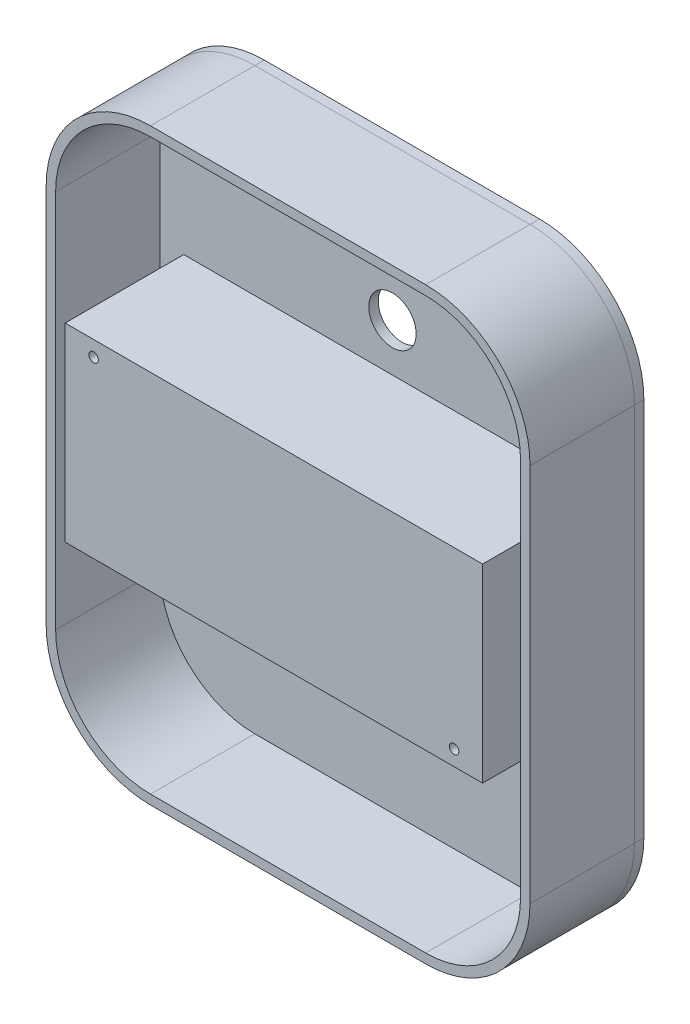
ISO-10303-21;
HEADER;
FILE_DESCRIPTION(('STEP AP214'),'2;1');
FILE_NAME('part.step','',(''),(''),'','','');
FILE_SCHEMA(('AUTOMOTIVE_DESIGN { 1 0 10303 214 1 1 1 1 }'));
ENDSEC;
DATA;
#1=APPLICATION_CONTEXT('core data for automotive mechanical design processes');
#2=APPLICATION_PROTOCOL_DEFINITION('international standard','automotive_design',2000,#1);
#3=PRODUCT_CONTEXT('',#1,'mechanical');
#4=PRODUCT('Part','Part','',(#3));
#5=PRODUCT_RELATED_PRODUCT_CATEGORY('part','',(#4));
#6=PRODUCT_DEFINITION_FORMATION('','',#4);
#7=PRODUCT_DEFINITION_CONTEXT('part definition',#1,'design');
#8=PRODUCT_DEFINITION('design','',#6,#7);
#9=PRODUCT_DEFINITION_SHAPE('','',#8);
#10=(LENGTH_UNIT() NAMED_UNIT(*) SI_UNIT(.MILLI.,.METRE.));
#11=(NAMED_UNIT(*) PLANE_ANGLE_UNIT() SI_UNIT($,.RADIAN.));
#12=(NAMED_UNIT(*) SI_UNIT($,.STERADIAN.) SOLID_ANGLE_UNIT());
#13=UNCERTAINTY_MEASURE_WITH_UNIT(LENGTH_MEASURE(1.E-05),#10,'distance_accuracy_value','');
#14=(GEOMETRIC_REPRESENTATION_CONTEXT(3) GLOBAL_UNCERTAINTY_ASSIGNED_CONTEXT((#13)) GLOBAL_UNIT_ASSIGNED_CONTEXT((#10,
#11,#12)) REPRESENTATION_CONTEXT('',''));
#15=CARTESIAN_POINT('',(0.,0.,0.));
#16=DIRECTION('',(0.,0.,1.));
#17=DIRECTION('',(1.,0.,0.));
#18=AXIS2_PLACEMENT_3D('',#15,#16,#17);
#19=CARTESIAN_POINT('',(0.,0.,25.));
#20=DIRECTION('',(0.,0.,1.));
#21=DIRECTION('',(1.,0.,0.));
#22=AXIS2_PLACEMENT_3D('',#19,#20,#21);
#23=PLANE('',#22);
#24=CARTESIAN_POINT('',(-38.,16.75,25.));
#25=DIRECTION('',(0.,0.,1.));
#26=DIRECTION('',(1.,0.,0.));
#27=AXIS2_PLACEMENT_3D('',#24,#25,#26);
#28=CIRCLE('',#27,0.999999999999998);
#29=CARTESIAN_POINT('',(-37.,16.75,25.));
#30=VERTEX_POINT('',#29);
#31=EDGE_CURVE('E220',#30,#30,#28,.T.);
#32=ORIENTED_EDGE('',*,*,#31,.F.);
#33=EDGE_LOOP('',(#32));
#34=FACE_BOUND('',#33,.T.);
#35=DIRECTION('',(1.,0.,0.));
#36=VECTOR('',#35,1.);
#37=CARTESIAN_POINT('',(-43.9999999999999,-20.,25.));
#38=LINE('',#37,#36);
#39=CARTESIAN_POINT('',(-43.9999999999999,-20.,25.));
#40=VERTEX_POINT('',#39);
#41=CARTESIAN_POINT('',(44.0000000000001,-19.9999999999997,25.));
#42=VERTEX_POINT('',#41);
#43=EDGE_CURVE('E226',#40,#42,#38,.T.);
#44=ORIENTED_EDGE('',*,*,#43,.T.);
#45=DIRECTION('',(0.,1.,0.));
#46=VECTOR('',#45,1.);
#47=CARTESIAN_POINT('',(44.0000000000001,-19.9999999999997,25.));
#48=LINE('',#47,#46);
#49=CARTESIAN_POINT('',(44.0000000000001,20.,25.));
#50=VERTEX_POINT('',#49);
#51=EDGE_CURVE('E228',#42,#50,#48,.T.);
#52=ORIENTED_EDGE('',*,*,#51,.T.);
#53=DIRECTION('',(-1.,0.,0.));
#54=VECTOR('',#53,1.);
#55=CARTESIAN_POINT('',(-44.,20.,25.));
#56=LINE('',#55,#54);
#57=CARTESIAN_POINT('',(-44.,20.,25.));
#58=VERTEX_POINT('',#57);
#59=EDGE_CURVE('E231',#50,#58,#56,.T.);
#60=ORIENTED_EDGE('',*,*,#59,.T.);
#61=DIRECTION('',(0.,-1.,0.));
#62=VECTOR('',#61,1.);
#63=CARTESIAN_POINT('',(-43.9999999999999,-20.,25.));
#64=LINE('',#63,#62);
#65=EDGE_CURVE('E65',#58,#40,#64,.T.);
#66=ORIENTED_EDGE('',*,*,#65,.T.);
#67=EDGE_LOOP('',(#44,#52,#60,#66));
#68=FACE_BOUND('',#67,.T.);
#69=CARTESIAN_POINT('',(38.,-16.75,25.));
#70=DIRECTION('',(0.,0.,1.));
#71=DIRECTION('',(1.,0.,0.));
#72=AXIS2_PLACEMENT_3D('',#69,#70,#71);
#73=CIRCLE('',#72,0.999999999999998);
#74=CARTESIAN_POINT('',(39.,-16.75,25.));
#75=VERTEX_POINT('',#74);
#76=EDGE_CURVE('E214',#75,#75,#73,.T.);
#77=ORIENTED_EDGE('',*,*,#76,.F.);
#78=EDGE_LOOP('',(#77));
#79=FACE_BOUND('',#78,.T.);
#80=ADVANCED_FACE('F49',(#34,#68,#79),#23,.T.);
#81=CARTESIAN_POINT('',(-43.9999999999999,-20.,25.));
#82=DIRECTION('',(0.,1.,0.));
#83=DIRECTION('',(-1.,0.,0.));
#84=AXIS2_PLACEMENT_3D('',#81,#82,#83);
#85=PLANE('',#84);
#86=DIRECTION('',(1.,0.,0.));
#87=VECTOR('',#86,1.);
#88=CARTESIAN_POINT('',(-43.9999999999999,-20.,0.));
#89=LINE('',#88,#87);
#90=CARTESIAN_POINT('',(-43.9999999999999,-20.,0.));
#91=VERTEX_POINT('',#90);
#92=CARTESIAN_POINT('',(44.0000000000001,-19.9999999999997,0.));
#93=VERTEX_POINT('',#92);
#94=EDGE_CURVE('E223',#91,#93,#89,.T.);
#95=ORIENTED_EDGE('',*,*,#94,.T.);
#96=DIRECTION('',(0.,0.,-1.));
#97=VECTOR('',#96,1.);
#98=CARTESIAN_POINT('',(44.0000000000001,-19.9999999999997,25.));
#99=LINE('',#98,#97);
#100=EDGE_CURVE('E12',#42,#93,#99,.T.);
#101=ORIENTED_EDGE('',*,*,#100,.F.);
#102=ORIENTED_EDGE('',*,*,#43,.F.);
#103=DIRECTION('',(0.,0.,-1.));
#104=VECTOR('',#103,1.);
#105=CARTESIAN_POINT('',(-43.9999999999999,-20.,25.));
#106=LINE('',#105,#104);
#107=EDGE_CURVE('E234',#40,#91,#106,.T.);
#108=ORIENTED_EDGE('',*,*,#107,.T.);
#109=EDGE_LOOP('',(#95,#101,#102,#108));
#110=FACE_BOUND('',#109,.T.);
#111=ADVANCED_FACE('F51',(#110),#85,.F.);
#112=CARTESIAN_POINT('',(44.0000000000001,-19.9999999999997,25.));
#113=DIRECTION('',(-1.,0.,0.));
#114=DIRECTION('',(0.,-1.,0.));
#115=AXIS2_PLACEMENT_3D('',#112,#113,#114);
#116=PLANE('',#115);
#117=DIRECTION('',(0.,1.,0.));
#118=VECTOR('',#117,1.);
#119=CARTESIAN_POINT('',(44.0000000000001,-19.9999999999997,0.));
#120=LINE('',#119,#118);
#121=CARTESIAN_POINT('',(44.0000000000001,20.,0.));
#122=VERTEX_POINT('',#121);
#123=EDGE_CURVE('E237',#93,#122,#120,.T.);
#124=ORIENTED_EDGE('',*,*,#123,.T.);
#125=DIRECTION('',(0.,0.,-1.));
#126=VECTOR('',#125,1.);
#127=CARTESIAN_POINT('',(44.0000000000001,20.,25.));
#128=LINE('',#127,#126);
#129=EDGE_CURVE('E58',#50,#122,#128,.T.);
#130=ORIENTED_EDGE('',*,*,#129,.F.);
#131=ORIENTED_EDGE('',*,*,#51,.F.);
#132=ORIENTED_EDGE('',*,*,#100,.T.);
#133=EDGE_LOOP('',(#124,#130,#131,#132));
#134=FACE_BOUND('',#133,.T.);
#135=ADVANCED_FACE('F257',(#134),#116,.F.);
#136=CARTESIAN_POINT('',(-44.,20.,25.));
#137=DIRECTION('',(0.,-1.,0.));
#138=DIRECTION('',(1.,0.,0.));
#139=AXIS2_PLACEMENT_3D('',#136,#137,#138);
#140=PLANE('',#139);
#141=DIRECTION('',(-1.,0.,0.));
#142=VECTOR('',#141,1.);
#143=CARTESIAN_POINT('',(-44.,20.,0.));
#144=LINE('',#143,#142);
#145=CARTESIAN_POINT('',(-44.,20.,0.));
#146=VERTEX_POINT('',#145);
#147=EDGE_CURVE('E240',#122,#146,#144,.T.);
#148=ORIENTED_EDGE('',*,*,#147,.T.);
#149=DIRECTION('',(0.,0.,-1.));
#150=VECTOR('',#149,1.);
#151=CARTESIAN_POINT('',(-44.,20.,25.));
#152=LINE('',#151,#150);
#153=EDGE_CURVE('E247',#58,#146,#152,.T.);
#154=ORIENTED_EDGE('',*,*,#153,.F.);
#155=ORIENTED_EDGE('',*,*,#59,.F.);
#156=ORIENTED_EDGE('',*,*,#129,.T.);
#157=EDGE_LOOP('',(#148,#154,#155,#156));
#158=FACE_BOUND('',#157,.T.);
#159=ADVANCED_FACE('F253',(#158),#140,.F.);
#160=CARTESIAN_POINT('',(-43.9999999999999,-20.,25.));
#161=DIRECTION('',(1.,0.,0.));
#162=DIRECTION('',(0.,1.,0.));
#163=AXIS2_PLACEMENT_3D('',#160,#161,#162);
#164=PLANE('',#163);
#165=DIRECTION('',(0.,-1.,0.));
#166=VECTOR('',#165,1.);
#167=CARTESIAN_POINT('',(-43.9999999999999,-20.,0.));
#168=LINE('',#167,#166);
#169=EDGE_CURVE('E229',#146,#91,#168,.T.);
#170=ORIENTED_EDGE('',*,*,#169,.T.);
#171=ORIENTED_EDGE('',*,*,#107,.F.);
#172=ORIENTED_EDGE('',*,*,#65,.F.);
#173=ORIENTED_EDGE('',*,*,#153,.T.);
#174=EDGE_LOOP('',(#170,#171,#172,#173));
#175=FACE_BOUND('',#174,.T.);
#176=ADVANCED_FACE('F263',(#175),#164,.F.);
#177=CARTESIAN_POINT('',(-38.,16.75,25.));
#178=DIRECTION('',(0.,0.,-1.));
#179=DIRECTION('',(-1.,0.,0.));
#180=AXIS2_PLACEMENT_3D('',#177,#178,#179);
#181=CYLINDRICAL_SURFACE('',#180,0.999999999999998);
#182=ORIENTED_EDGE('',*,*,#31,.T.);
#183=EDGE_LOOP('',(#182));
#184=FACE_BOUND('',#183,.T.);
#185=CARTESIAN_POINT('',(-38.,16.75,0.));
#186=DIRECTION('',(0.,0.,1.));
#187=DIRECTION('',(1.,0.,0.));
#188=AXIS2_PLACEMENT_3D('',#185,#186,#187);
#189=CIRCLE('',#188,0.999999999999998);
#190=CARTESIAN_POINT('',(-37.,16.75,0.));
#191=VERTEX_POINT('',#190);
#192=EDGE_CURVE('E217',#191,#191,#189,.T.);
#193=ORIENTED_EDGE('',*,*,#192,.F.);
#194=EDGE_LOOP('',(#193));
#195=FACE_BOUND('',#194,.T.);
#196=ADVANCED_FACE('F276',(#184,#195),#181,.F.);
#197=CARTESIAN_POINT('',(38.,-16.75,25.));
#198=DIRECTION('',(0.,0.,-1.));
#199=DIRECTION('',(-1.,0.,0.));
#200=AXIS2_PLACEMENT_3D('',#197,#198,#199);
#201=CYLINDRICAL_SURFACE('',#200,0.999999999999998);
#202=ORIENTED_EDGE('',*,*,#76,.T.);
#203=EDGE_LOOP('',(#202));
#204=FACE_BOUND('',#203,.T.);
#205=CARTESIAN_POINT('',(38.,-16.75,0.));
#206=DIRECTION('',(0.,0.,1.));
#207=DIRECTION('',(1.,0.,0.));
#208=AXIS2_PLACEMENT_3D('',#205,#206,#207);
#209=CIRCLE('',#208,0.999999999999998);
#210=CARTESIAN_POINT('',(39.,-16.75,0.));
#211=VERTEX_POINT('',#210);
#212=EDGE_CURVE('E202',#211,#211,#209,.T.);
#213=ORIENTED_EDGE('',*,*,#212,.F.);
#214=EDGE_LOOP('',(#213));
#215=FACE_BOUND('',#214,.T.);
#216=ADVANCED_FACE('F272',(#204,#215),#201,.F.);
#217=CARTESIAN_POINT('',(-29.,40.,0.));
#218=DIRECTION('',(0.,0.,-1.));
#219=DIRECTION('',(-1.,0.,0.));
#220=AXIS2_PLACEMENT_3D('',#217,#218,#219);
#221=PLANE('',#220);
#222=ORIENTED_EDGE('',*,*,#212,.T.);
#223=EDGE_LOOP('',(#222));
#224=FACE_BOUND('',#223,.T.);
#225=ADVANCED_FACE('F275',(#224),#221,.F.);
#226=ORIENTED_EDGE('',*,*,#192,.T.);
#227=EDGE_LOOP('',(#226));
#228=FACE_BOUND('',#227,.T.);
#229=ADVANCED_FACE('F281',(#228),#221,.F.);
#230=CARTESIAN_POINT('',(-29.,40.,-2.));
#231=DIRECTION('',(0.,0.,1.));
#232=DIRECTION('',(1.,0.,0.));
#233=AXIS2_PLACEMENT_3D('',#230,#231,#232);
#234=CYLINDRICAL_SURFACE('',#233,22.);
#235=CARTESIAN_POINT('',(-29.,40.,0.));
#236=DIRECTION('',(0.,0.,1.));
#237=DIRECTION('',(-1.,0.,0.));
#238=AXIS2_PLACEMENT_3D('',#235,#236,#237);
#239=CIRCLE('',#238,22.);
#240=CARTESIAN_POINT('',(-29.,62.,0.));
#241=VERTEX_POINT('',#240);
#242=CARTESIAN_POINT('',(-51.,40.,0.));
#243=VERTEX_POINT('',#242);
#244=EDGE_CURVE('E183',#241,#243,#239,.T.);
#245=ORIENTED_EDGE('',*,*,#244,.F.);
#246=DIRECTION('',(0.,0.,1.));
#247=VECTOR('',#246,1.);
#248=CARTESIAN_POINT('',(-29.,62.,-2.));
#249=LINE('',#248,#247);
#250=CARTESIAN_POINT('',(-29.,62.,-2.));
#251=VERTEX_POINT('',#250);
#252=EDGE_CURVE('E159',#251,#241,#249,.T.);
#253=ORIENTED_EDGE('',*,*,#252,.F.);
#254=CARTESIAN_POINT('',(-29.,40.,-2.));
#255=DIRECTION('',(0.,0.,1.));
#256=DIRECTION('',(-1.,0.,0.));
#257=AXIS2_PLACEMENT_3D('',#254,#255,#256);
#258=CIRCLE('',#257,22.);
#259=CARTESIAN_POINT('',(-51.,40.,-2.));
#260=VERTEX_POINT('',#259);
#261=EDGE_CURVE('E152',#251,#260,#258,.T.);
#262=ORIENTED_EDGE('',*,*,#261,.T.);
#263=DIRECTION('',(0.,0.,1.));
#264=VECTOR('',#263,1.);
#265=CARTESIAN_POINT('',(-51.,40.,-2.));
#266=LINE('',#265,#264);
#267=EDGE_CURVE('E134',#260,#243,#266,.T.);
#268=ORIENTED_EDGE('',*,*,#267,.T.);
#269=EDGE_LOOP('',(#245,#253,#262,#268));
#270=FACE_BOUND('',#269,.T.);
#271=ADVANCED_FACE('F158',(#270),#234,.T.);
#272=CARTESIAN_POINT('',(-29.,62.,-2.));
#273=DIRECTION('',(0.,1.,0.));
#274=DIRECTION('',(0.,0.,1.));
#275=AXIS2_PLACEMENT_3D('',#272,#273,#274);
#276=PLANE('',#275);
#277=DIRECTION('',(-1.,0.,0.));
#278=VECTOR('',#277,1.);
#279=CARTESIAN_POINT('',(-29.,62.,0.));
#280=LINE('',#279,#278);
#281=CARTESIAN_POINT('',(29.,62.,0.));
#282=VERTEX_POINT('',#281);
#283=EDGE_CURVE('E160',#282,#241,#280,.T.);
#284=ORIENTED_EDGE('',*,*,#283,.F.);
#285=DIRECTION('',(0.,0.,1.));
#286=VECTOR('',#285,1.);
#287=CARTESIAN_POINT('',(29.,62.,-2.));
#288=LINE('',#287,#286);
#289=CARTESIAN_POINT('',(29.,62.,-2.));
#290=VERTEX_POINT('',#289);
#291=EDGE_CURVE('E203',#290,#282,#288,.T.);
#292=ORIENTED_EDGE('',*,*,#291,.F.);
#293=DIRECTION('',(-1.,0.,0.));
#294=VECTOR('',#293,1.);
#295=CARTESIAN_POINT('',(-29.,62.,-2.));
#296=LINE('',#295,#294);
#297=EDGE_CURVE('E145',#290,#251,#296,.T.);
#298=ORIENTED_EDGE('',*,*,#297,.T.);
#299=ORIENTED_EDGE('',*,*,#252,.T.);
#300=EDGE_LOOP('',(#284,#292,#298,#299));
#301=FACE_BOUND('',#300,.T.);
#302=ADVANCED_FACE('F350',(#301),#276,.T.);
#303=CARTESIAN_POINT('',(29.,40.,-2.));
#304=DIRECTION('',(0.,0.,1.));
#305=DIRECTION('',(1.,0.,0.));
#306=AXIS2_PLACEMENT_3D('',#303,#304,#305);
#307=CYLINDRICAL_SURFACE('',#306,22.);
#308=CARTESIAN_POINT('',(29.,40.,0.));
#309=DIRECTION('',(0.,0.,1.));
#310=DIRECTION('',(1.,0.,0.));
#311=AXIS2_PLACEMENT_3D('',#308,#309,#310);
#312=CIRCLE('',#311,22.);
#313=CARTESIAN_POINT('',(51.,40.,0.));
#314=VERTEX_POINT('',#313);
#315=EDGE_CURVE('E163',#314,#282,#312,.T.);
#316=ORIENTED_EDGE('',*,*,#315,.F.);
#317=DIRECTION('',(0.,0.,1.));
#318=VECTOR('',#317,1.);
#319=CARTESIAN_POINT('',(51.,40.,-2.));
#320=LINE('',#319,#318);
#321=CARTESIAN_POINT('',(51.,40.,-2.));
#322=VERTEX_POINT('',#321);
#323=EDGE_CURVE('E205',#322,#314,#320,.T.);
#324=ORIENTED_EDGE('',*,*,#323,.F.);
#325=CARTESIAN_POINT('',(29.,40.,-2.));
#326=DIRECTION('',(0.,0.,1.));
#327=DIRECTION('',(1.,0.,0.));
#328=AXIS2_PLACEMENT_3D('',#325,#326,#327);
#329=CIRCLE('',#328,22.);
#330=EDGE_CURVE('E179',#322,#290,#329,.T.);
#331=ORIENTED_EDGE('',*,*,#330,.T.);
#332=ORIENTED_EDGE('',*,*,#291,.T.);
#333=EDGE_LOOP('',(#316,#324,#331,#332));
#334=FACE_BOUND('',#333,.T.);
#335=ADVANCED_FACE('F464',(#334),#307,.T.);
#336=CARTESIAN_POINT('',(51.,40.,-2.));
#337=DIRECTION('',(1.,0.,0.));
#338=DIRECTION('',(0.,1.,0.));
#339=AXIS2_PLACEMENT_3D('',#336,#337,#338);
#340=PLANE('',#339);
#341=DIRECTION('',(0.,1.,0.));
#342=VECTOR('',#341,1.);
#343=CARTESIAN_POINT('',(51.,40.,0.));
#344=LINE('',#343,#342);
#345=CARTESIAN_POINT('',(51.,-40.,0.));
#346=VERTEX_POINT('',#345);
#347=EDGE_CURVE('E196',#346,#314,#344,.T.);
#348=ORIENTED_EDGE('',*,*,#347,.F.);
#349=DIRECTION('',(0.,0.,1.));
#350=VECTOR('',#349,1.);
#351=CARTESIAN_POINT('',(51.,-40.,-2.));
#352=LINE('',#351,#350);
#353=CARTESIAN_POINT('',(51.,-40.,-2.));
#354=VERTEX_POINT('',#353);
#355=EDGE_CURVE('E207',#354,#346,#352,.T.);
#356=ORIENTED_EDGE('',*,*,#355,.F.);
#357=DIRECTION('',(0.,1.,0.));
#358=VECTOR('',#357,1.);
#359=CARTESIAN_POINT('',(51.,40.,-2.));
#360=LINE('',#359,#358);
#361=EDGE_CURVE('E176',#354,#322,#360,.T.);
#362=ORIENTED_EDGE('',*,*,#361,.T.);
#363=ORIENTED_EDGE('',*,*,#323,.T.);
#364=EDGE_LOOP('',(#348,#356,#362,#363));
#365=FACE_BOUND('',#364,.T.);
#366=ADVANCED_FACE('F357',(#365),#340,.T.);
#367=CARTESIAN_POINT('',(29.,-40.,-2.));
#368=DIRECTION('',(0.,0.,1.));
#369=DIRECTION('',(1.,0.,0.));
#370=AXIS2_PLACEMENT_3D('',#367,#368,#369);
#371=CYLINDRICAL_SURFACE('',#370,22.);
#372=CARTESIAN_POINT('',(29.,-40.,0.));
#373=DIRECTION('',(0.,0.,1.));
#374=DIRECTION('',(-1.,0.,0.));
#375=AXIS2_PLACEMENT_3D('',#372,#373,#374);
#376=CIRCLE('',#375,22.);
#377=CARTESIAN_POINT('',(29.,-62.,0.));
#378=VERTEX_POINT('',#377);
#379=EDGE_CURVE('E193',#378,#346,#376,.T.);
#380=ORIENTED_EDGE('',*,*,#379,.F.);
#381=DIRECTION('',(0.,0.,1.));
#382=VECTOR('',#381,1.);
#383=CARTESIAN_POINT('',(29.,-62.,-2.));
#384=LINE('',#383,#382);
#385=CARTESIAN_POINT('',(29.,-62.,-2.));
#386=VERTEX_POINT('',#385);
#387=EDGE_CURVE('E209',#386,#378,#384,.T.);
#388=ORIENTED_EDGE('',*,*,#387,.F.);
#389=CARTESIAN_POINT('',(29.,-40.,-2.));
#390=DIRECTION('',(0.,0.,1.));
#391=DIRECTION('',(-1.,0.,0.));
#392=AXIS2_PLACEMENT_3D('',#389,#390,#391);
#393=CIRCLE('',#392,22.);
#394=EDGE_CURVE('E173',#386,#354,#393,.T.);
#395=ORIENTED_EDGE('',*,*,#394,.T.);
#396=ORIENTED_EDGE('',*,*,#355,.T.);
#397=EDGE_LOOP('',(#380,#388,#395,#396));
#398=FACE_BOUND('',#397,.T.);
#399=ADVANCED_FACE('F360',(#398),#371,.T.);
#400=CARTESIAN_POINT('',(-29.,-62.,-2.));
#401=DIRECTION('',(0.,-1.,0.));
#402=DIRECTION('',(1.,0.,0.));
#403=AXIS2_PLACEMENT_3D('',#400,#401,#402);
#404=PLANE('',#403);
#405=DIRECTION('',(1.,0.,0.));
#406=VECTOR('',#405,1.);
#407=CARTESIAN_POINT('',(-29.,-62.,0.));
#408=LINE('',#407,#406);
#409=CARTESIAN_POINT('',(-29.,-62.,0.));
#410=VERTEX_POINT('',#409);
#411=EDGE_CURVE('E190',#410,#378,#408,.T.);
#412=ORIENTED_EDGE('',*,*,#411,.F.);
#413=DIRECTION('',(0.,0.,1.));
#414=VECTOR('',#413,1.);
#415=CARTESIAN_POINT('',(-29.,-62.,-2.));
#416=LINE('',#415,#414);
#417=CARTESIAN_POINT('',(-29.,-62.,-2.));
#418=VERTEX_POINT('',#417);
#419=EDGE_CURVE('E211',#418,#410,#416,.T.);
#420=ORIENTED_EDGE('',*,*,#419,.F.);
#421=DIRECTION('',(1.,0.,0.));
#422=VECTOR('',#421,1.);
#423=CARTESIAN_POINT('',(-29.,-62.,-2.));
#424=LINE('',#423,#422);
#425=EDGE_CURVE('E170',#418,#386,#424,.T.);
#426=ORIENTED_EDGE('',*,*,#425,.T.);
#427=ORIENTED_EDGE('',*,*,#387,.T.);
#428=EDGE_LOOP('',(#412,#420,#426,#427));
#429=FACE_BOUND('',#428,.T.);
#430=ADVANCED_FACE('F363',(#429),#404,.T.);
#431=CARTESIAN_POINT('',(-29.,-40.,-2.));
#432=DIRECTION('',(0.,0.,1.));
#433=DIRECTION('',(1.,0.,0.));
#434=AXIS2_PLACEMENT_3D('',#431,#432,#433);
#435=CYLINDRICAL_SURFACE('',#434,22.);
#436=CARTESIAN_POINT('',(-29.,-40.,0.));
#437=DIRECTION('',(0.,0.,1.));
#438=DIRECTION('',(-1.,0.,0.));
#439=AXIS2_PLACEMENT_3D('',#436,#437,#438);
#440=CIRCLE('',#439,22.);
#441=CARTESIAN_POINT('',(-51.,-40.,0.));
#442=VERTEX_POINT('',#441);
#443=EDGE_CURVE('E187',#442,#410,#440,.T.);
#444=ORIENTED_EDGE('',*,*,#443,.F.);
#445=DIRECTION('',(0.,0.,1.));
#446=VECTOR('',#445,1.);
#447=CARTESIAN_POINT('',(-51.,-40.,-2.));
#448=LINE('',#447,#446);
#449=CARTESIAN_POINT('',(-51.,-40.,-2.));
#450=VERTEX_POINT('',#449);
#451=EDGE_CURVE('E144',#450,#442,#448,.T.);
#452=ORIENTED_EDGE('',*,*,#451,.F.);
#453=CARTESIAN_POINT('',(-29.,-40.,-2.));
#454=DIRECTION('',(0.,0.,1.));
#455=DIRECTION('',(-1.,0.,0.));
#456=AXIS2_PLACEMENT_3D('',#453,#454,#455);
#457=CIRCLE('',#456,22.);
#458=EDGE_CURVE('E156',#450,#418,#457,.T.);
#459=ORIENTED_EDGE('',*,*,#458,.T.);
#460=ORIENTED_EDGE('',*,*,#419,.T.);
#461=EDGE_LOOP('',(#444,#452,#459,#460));
#462=FACE_BOUND('',#461,.T.);
#463=ADVANCED_FACE('F302',(#462),#435,.T.);
#464=CARTESIAN_POINT('',(-51.,40.,-2.));
#465=DIRECTION('',(-1.,0.,0.));
#466=DIRECTION('',(0.,-1.,0.));
#467=AXIS2_PLACEMENT_3D('',#464,#465,#466);
#468=PLANE('',#467);
#469=DIRECTION('',(0.,-1.,0.));
#470=VECTOR('',#469,1.);
#471=CARTESIAN_POINT('',(-51.,40.,0.));
#472=LINE('',#471,#470);
#473=EDGE_CURVE('E139',#243,#442,#472,.T.);
#474=ORIENTED_EDGE('',*,*,#473,.F.);
#475=ORIENTED_EDGE('',*,*,#267,.F.);
#476=DIRECTION('',(0.,-1.,0.));
#477=VECTOR('',#476,1.);
#478=CARTESIAN_POINT('',(-51.,40.,-2.));
#479=LINE('',#478,#477);
#480=EDGE_CURVE('E137',#260,#450,#479,.T.);
#481=ORIENTED_EDGE('',*,*,#480,.T.);
#482=ORIENTED_EDGE('',*,*,#451,.T.);
#483=EDGE_LOOP('',(#474,#475,#481,#482));
#484=FACE_BOUND('',#483,.T.);
#485=ADVANCED_FACE('F136',(#484),#468,.T.);
#486=CARTESIAN_POINT('',(-29.,40.,-2.));
#487=DIRECTION('',(0.,0.,-1.));
#488=DIRECTION('',(-1.,0.,0.));
#489=AXIS2_PLACEMENT_3D('',#486,#487,#488);
#490=PLANE('',#489);
#491=CARTESIAN_POINT('',(0.,-30.,-2.));
#492=DIRECTION('',(0.,0.,1.));
#493=DIRECTION('',(1.,0.,0.));
#494=AXIS2_PLACEMENT_3D('',#491,#492,#493);
#495=CIRCLE('',#494,5.);
#496=CARTESIAN_POINT('',(5.,-30.,-2.));
#497=VERTEX_POINT('',#496);
#498=EDGE_CURVE('E321',#497,#497,#495,.T.);
#499=ORIENTED_EDGE('',*,*,#498,.T.);
#500=EDGE_LOOP('',(#499));
#501=FACE_BOUND('',#500,.T.);
#502=CARTESIAN_POINT('',(0.,30.,-2.));
#503=DIRECTION('',(0.,0.,1.));
#504=DIRECTION('',(1.,0.,0.));
#505=AXIS2_PLACEMENT_3D('',#502,#503,#504);
#506=CIRCLE('',#505,5.);
#507=CARTESIAN_POINT('',(5.,30.,-2.));
#508=VERTEX_POINT('',#507);
#509=EDGE_CURVE('E329',#508,#508,#506,.T.);
#510=ORIENTED_EDGE('',*,*,#509,.T.);
#511=EDGE_LOOP('',(#510));
#512=FACE_BOUND('',#511,.T.);
#513=CARTESIAN_POINT('',(0.,-41.,-2.));
#514=DIRECTION('',(0.,0.,1.));
#515=DIRECTION('',(1.,0.,0.));
#516=AXIS2_PLACEMENT_3D('',#513,#514,#515);
#517=CIRCLE('',#516,1.75);
#518=CARTESIAN_POINT('',(1.75000000000001,-41.,-2.));
#519=VERTEX_POINT('',#518);
#520=EDGE_CURVE('E335',#519,#519,#517,.T.);
#521=ORIENTED_EDGE('',*,*,#520,.T.);
#522=EDGE_LOOP('',(#521));
#523=FACE_BOUND('',#522,.T.);
#524=CARTESIAN_POINT('',(0.,41.,-2.));
#525=DIRECTION('',(0.,0.,1.));
#526=DIRECTION('',(1.,0.,0.));
#527=AXIS2_PLACEMENT_3D('',#524,#525,#526);
#528=CIRCLE('',#527,1.75);
#529=CARTESIAN_POINT('',(1.75000000000001,41.,-2.));
#530=VERTEX_POINT('',#529);
#531=EDGE_CURVE('E185',#530,#530,#528,.T.);
#532=ORIENTED_EDGE('',*,*,#531,.T.);
#533=EDGE_LOOP('',(#532));
#534=FACE_BOUND('',#533,.T.);
#535=ORIENTED_EDGE('',*,*,#261,.F.);
#536=ORIENTED_EDGE('',*,*,#297,.F.);
#537=ORIENTED_EDGE('',*,*,#330,.F.);
#538=ORIENTED_EDGE('',*,*,#361,.F.);
#539=ORIENTED_EDGE('',*,*,#394,.F.);
#540=ORIENTED_EDGE('',*,*,#425,.F.);
#541=ORIENTED_EDGE('',*,*,#458,.F.);
#542=ORIENTED_EDGE('',*,*,#480,.F.);
#543=EDGE_LOOP('',(#535,#536,#537,#538,#539,#540,#541,#542));
#544=FACE_BOUND('',#543,.T.);
#545=ADVANCED_FACE('F150',(#501,#512,#523,#534,#544),#490,.T.);
#546=ORIENTED_EDGE('',*,*,#94,.F.);
#547=ORIENTED_EDGE('',*,*,#169,.F.);
#548=ORIENTED_EDGE('',*,*,#147,.F.);
#549=ORIENTED_EDGE('',*,*,#123,.F.);
#550=EDGE_LOOP('',(#546,#547,#548,#549));
#551=FACE_BOUND('',#550,.T.);
#552=CARTESIAN_POINT('',(0.,-30.,0.));
#553=DIRECTION('',(0.,0.,1.));
#554=DIRECTION('',(1.,0.,0.));
#555=AXIS2_PLACEMENT_3D('',#552,#553,#554);
#556=CIRCLE('',#555,5.);
#557=CARTESIAN_POINT('',(5.,-30.,0.));
#558=VERTEX_POINT('',#557);
#559=EDGE_CURVE('E324',#558,#558,#556,.T.);
#560=ORIENTED_EDGE('',*,*,#559,.F.);
#561=EDGE_LOOP('',(#560));
#562=FACE_BOUND('',#561,.T.);
#563=CARTESIAN_POINT('',(0.,30.,0.));
#564=DIRECTION('',(0.,0.,1.));
#565=DIRECTION('',(1.,0.,0.));
#566=AXIS2_PLACEMENT_3D('',#563,#564,#565);
#567=CIRCLE('',#566,5.);
#568=CARTESIAN_POINT('',(5.,30.,0.));
#569=VERTEX_POINT('',#568);
#570=EDGE_CURVE('E326',#569,#569,#567,.T.);
#571=ORIENTED_EDGE('',*,*,#570,.F.);
#572=EDGE_LOOP('',(#571));
#573=FACE_BOUND('',#572,.T.);
#574=CARTESIAN_POINT('',(0.,-41.,0.));
#575=DIRECTION('',(0.,0.,1.));
#576=DIRECTION('',(1.,0.,0.));
#577=AXIS2_PLACEMENT_3D('',#574,#575,#576);
#578=CIRCLE('',#577,1.75);
#579=CARTESIAN_POINT('',(1.75000000000001,-41.,0.));
#580=VERTEX_POINT('',#579);
#581=EDGE_CURVE('E332',#580,#580,#578,.T.);
#582=ORIENTED_EDGE('',*,*,#581,.F.);
#583=EDGE_LOOP('',(#582));
#584=FACE_BOUND('',#583,.T.);
#585=CARTESIAN_POINT('',(0.,41.,0.));
#586=DIRECTION('',(0.,0.,1.));
#587=DIRECTION('',(1.,0.,0.));
#588=AXIS2_PLACEMENT_3D('',#585,#586,#587);
#589=CIRCLE('',#588,1.75);
#590=CARTESIAN_POINT('',(1.75000000000001,41.,0.));
#591=VERTEX_POINT('',#590);
#592=EDGE_CURVE('E166',#591,#591,#589,.T.);
#593=ORIENTED_EDGE('',*,*,#592,.F.);
#594=EDGE_LOOP('',(#593));
#595=FACE_BOUND('',#594,.T.);
#596=ORIENTED_EDGE('',*,*,#244,.T.);
#597=ORIENTED_EDGE('',*,*,#473,.T.);
#598=ORIENTED_EDGE('',*,*,#443,.T.);
#599=ORIENTED_EDGE('',*,*,#411,.T.);
#600=ORIENTED_EDGE('',*,*,#379,.T.);
#601=ORIENTED_EDGE('',*,*,#347,.T.);
#602=ORIENTED_EDGE('',*,*,#315,.T.);
#603=ORIENTED_EDGE('',*,*,#283,.T.);
#604=EDGE_LOOP('',(#596,#597,#598,#599,#600,#601,#602,#603));
#605=FACE_BOUND('',#604,.T.);
#606=ADVANCED_FACE('F260',(#551,#562,#573,#584,#595,#605),#221,.F.);
#607=CARTESIAN_POINT('',(0.,41.,-2.));
#608=DIRECTION('',(0.,0.,1.));
#609=DIRECTION('',(1.,0.,0.));
#610=AXIS2_PLACEMENT_3D('',#607,#608,#609);
#611=CYLINDRICAL_SURFACE('',#610,1.75);
#612=ORIENTED_EDGE('',*,*,#531,.F.);
#613=EDGE_LOOP('',(#612));
#614=FACE_BOUND('',#613,.T.);
#615=ORIENTED_EDGE('',*,*,#592,.T.);
#616=EDGE_LOOP('',(#615));
#617=FACE_BOUND('',#616,.T.);
#618=ADVANCED_FACE('F290',(#614,#617),#611,.F.);
#619=CARTESIAN_POINT('',(0.,-41.,-2.));
#620=DIRECTION('',(0.,0.,1.));
#621=DIRECTION('',(1.,0.,0.));
#622=AXIS2_PLACEMENT_3D('',#619,#620,#621);
#623=CYLINDRICAL_SURFACE('',#622,1.75);
#624=ORIENTED_EDGE('',*,*,#520,.F.);
#625=EDGE_LOOP('',(#624));
#626=FACE_BOUND('',#625,.T.);
#627=ORIENTED_EDGE('',*,*,#581,.T.);
#628=EDGE_LOOP('',(#627));
#629=FACE_BOUND('',#628,.T.);
#630=ADVANCED_FACE('F295',(#626,#629),#623,.F.);
#631=CARTESIAN_POINT('',(0.,30.,-2.));
#632=DIRECTION('',(0.,0.,1.));
#633=DIRECTION('',(1.,0.,0.));
#634=AXIS2_PLACEMENT_3D('',#631,#632,#633);
#635=CYLINDRICAL_SURFACE('',#634,5.);
#636=ORIENTED_EDGE('',*,*,#509,.F.);
#637=EDGE_LOOP('',(#636));
#638=FACE_BOUND('',#637,.T.);
#639=ORIENTED_EDGE('',*,*,#570,.T.);
#640=EDGE_LOOP('',(#639));
#641=FACE_BOUND('',#640,.T.);
#642=ADVANCED_FACE('F309',(#638,#641),#635,.F.);
#643=CARTESIAN_POINT('',(0.,-30.,-2.));
#644=DIRECTION('',(0.,0.,1.));
#645=DIRECTION('',(1.,0.,0.));
#646=AXIS2_PLACEMENT_3D('',#643,#644,#645);
#647=CYLINDRICAL_SURFACE('',#646,5.);
#648=ORIENTED_EDGE('',*,*,#498,.F.);
#649=EDGE_LOOP('',(#648));
#650=FACE_BOUND('',#649,.T.);
#651=ORIENTED_EDGE('',*,*,#559,.T.);
#652=EDGE_LOOP('',(#651));
#653=FACE_BOUND('',#652,.T.);
#654=ADVANCED_FACE('F313',(#650,#653),#647,.F.);
#655=CLOSED_SHELL('',(#80,#111,#135,#159,#176,#196,#216,#225,#229,#271,#302,#335,#366,#399,#430,
#463,#485,#545,#606,#618,#630,#642,#654));
#656=MANIFOLD_SOLID_BREP('B2',#655);
#657=CARTESIAN_POINT('',(-29.,40.,22.));
#658=DIRECTION('',(0.,0.,-1.));
#659=DIRECTION('',(-1.,0.,0.));
#660=AXIS2_PLACEMENT_3D('',#657,#658,#659);
#661=PLANE('',#660);
#662=CARTESIAN_POINT('',(-29.,40.,22.));
#663=DIRECTION('',(0.,0.,1.));
#664=DIRECTION('',(-1.,0.,0.));
#665=AXIS2_PLACEMENT_3D('',#662,#663,#664);
#666=CIRCLE('',#665,22.);
#667=CARTESIAN_POINT('',(-29.,62.,22.));
#668=VERTEX_POINT('',#667);
#669=CARTESIAN_POINT('',(-51.,40.,22.));
#670=VERTEX_POINT('',#669);
#671=EDGE_CURVE('E773',#668,#670,#666,.T.);
#672=ORIENTED_EDGE('',*,*,#671,.T.);
#673=DIRECTION('',(0.,-1.,0.));
#674=VECTOR('',#673,1.);
#675=CARTESIAN_POINT('',(-51.,40.,22.));
#676=LINE('',#675,#674);
#677=CARTESIAN_POINT('',(-51.,-40.,22.));
#678=VERTEX_POINT('',#677);
#679=EDGE_CURVE('E776',#670,#678,#676,.T.);
#680=ORIENTED_EDGE('',*,*,#679,.T.);
#681=CARTESIAN_POINT('',(-29.,-40.,22.));
#682=DIRECTION('',(0.,0.,1.));
#683=DIRECTION('',(-1.,0.,0.));
#684=AXIS2_PLACEMENT_3D('',#681,#682,#683);
#685=CIRCLE('',#684,22.);
#686=CARTESIAN_POINT('',(-29.,-62.,22.));
#687=VERTEX_POINT('',#686);
#688=EDGE_CURVE('E779',#678,#687,#685,.T.);
#689=ORIENTED_EDGE('',*,*,#688,.T.);
#690=DIRECTION('',(1.,0.,0.));
#691=VECTOR('',#690,1.);
#692=CARTESIAN_POINT('',(-29.,-62.,22.));
#693=LINE('',#692,#691);
#694=CARTESIAN_POINT('',(29.,-62.,22.));
#695=VERTEX_POINT('',#694);
#696=EDGE_CURVE('E781',#687,#695,#693,.T.);
#697=ORIENTED_EDGE('',*,*,#696,.T.);
#698=CARTESIAN_POINT('',(29.,-40.,22.));
#699=DIRECTION('',(0.,0.,1.));
#700=DIRECTION('',(-1.,0.,0.));
#701=AXIS2_PLACEMENT_3D('',#698,#699,#700);
#702=CIRCLE('',#701,22.);
#703=CARTESIAN_POINT('',(51.,-40.,22.));
#704=VERTEX_POINT('',#703);
#705=EDGE_CURVE('E783',#695,#704,#702,.T.);
#706=ORIENTED_EDGE('',*,*,#705,.T.);
#707=DIRECTION('',(0.,1.,0.));
#708=VECTOR('',#707,1.);
#709=CARTESIAN_POINT('',(51.,40.,22.));
#710=LINE('',#709,#708);
#711=CARTESIAN_POINT('',(51.,40.,22.));
#712=VERTEX_POINT('',#711);
#713=EDGE_CURVE('E785',#704,#712,#710,.T.);
#714=ORIENTED_EDGE('',*,*,#713,.T.);
#715=CARTESIAN_POINT('',(29.,40.,22.));
#716=DIRECTION('',(0.,0.,1.));
#717=DIRECTION('',(1.,0.,0.));
#718=AXIS2_PLACEMENT_3D('',#715,#716,#717);
#719=CIRCLE('',#718,22.);
#720=CARTESIAN_POINT('',(29.,62.,22.));
#721=VERTEX_POINT('',#720);
#722=EDGE_CURVE('E787',#712,#721,#719,.T.);
#723=ORIENTED_EDGE('',*,*,#722,.T.);
#724=DIRECTION('',(-1.,0.,0.));
#725=VECTOR('',#724,1.);
#726=CARTESIAN_POINT('',(-29.,62.,22.));
#727=LINE('',#726,#725);
#728=EDGE_CURVE('E789',#721,#668,#727,.T.);
#729=ORIENTED_EDGE('',*,*,#728,.T.);
#730=EDGE_LOOP('',(#672,#680,#689,#697,#706,#714,#723,#729));
#731=FACE_BOUND('',#730,.T.);
#732=CARTESIAN_POINT('',(29.,40.,22.));
#733=DIRECTION('',(0.,0.,1.));
#734=DIRECTION('',(1.,0.,0.));
#735=AXIS2_PLACEMENT_3D('',#732,#733,#734);
#736=CIRCLE('',#735,20.);
#737=CARTESIAN_POINT('',(49.,40.,22.));
#738=VERTEX_POINT('',#737);
#739=CARTESIAN_POINT('',(29.,60.,22.));
#740=VERTEX_POINT('',#739);
#741=EDGE_CURVE('E708',#738,#740,#736,.T.);
#742=ORIENTED_EDGE('',*,*,#741,.F.);
#743=DIRECTION('',(0.,1.,0.));
#744=VECTOR('',#743,1.);
#745=CARTESIAN_POINT('',(49.,40.,22.));
#746=LINE('',#745,#744);
#747=CARTESIAN_POINT('',(49.,-40.,22.));
#748=VERTEX_POINT('',#747);
#749=EDGE_CURVE('E741',#748,#738,#746,.T.);
#750=ORIENTED_EDGE('',*,*,#749,.F.);
#751=CARTESIAN_POINT('',(29.,-40.,22.));
#752=DIRECTION('',(0.,0.,1.));
#753=DIRECTION('',(-1.,0.,0.));
#754=AXIS2_PLACEMENT_3D('',#751,#752,#753);
#755=CIRCLE('',#754,20.);
#756=CARTESIAN_POINT('',(29.,-60.,22.));
#757=VERTEX_POINT('',#756);
#758=EDGE_CURVE('E739',#757,#748,#755,.T.);
#759=ORIENTED_EDGE('',*,*,#758,.F.);
#760=DIRECTION('',(1.,0.,0.));
#761=VECTOR('',#760,1.);
#762=CARTESIAN_POINT('',(-29.,-60.,22.));
#763=LINE('',#762,#761);
#764=CARTESIAN_POINT('',(-29.,-60.,22.));
#765=VERTEX_POINT('',#764);
#766=EDGE_CURVE('E737',#765,#757,#763,.T.);
#767=ORIENTED_EDGE('',*,*,#766,.F.);
#768=CARTESIAN_POINT('',(-29.,-40.,22.));
#769=DIRECTION('',(0.,0.,1.));
#770=DIRECTION('',(-1.,0.,0.));
#771=AXIS2_PLACEMENT_3D('',#768,#769,#770);
#772=CIRCLE('',#771,20.);
#773=CARTESIAN_POINT('',(-49.,-40.,22.));
#774=VERTEX_POINT('',#773);
#775=EDGE_CURVE('E735',#774,#765,#772,.T.);
#776=ORIENTED_EDGE('',*,*,#775,.F.);
#777=DIRECTION('',(0.,-1.,0.));
#778=VECTOR('',#777,1.);
#779=CARTESIAN_POINT('',(-49.,40.,22.));
#780=LINE('',#779,#778);
#781=CARTESIAN_POINT('',(-49.,40.,22.));
#782=VERTEX_POINT('',#781);
#783=EDGE_CURVE('E731',#782,#774,#780,.T.);
#784=ORIENTED_EDGE('',*,*,#783,.F.);
#785=CARTESIAN_POINT('',(-29.,40.,22.));
#786=DIRECTION('',(0.,0.,1.));
#787=DIRECTION('',(-1.,0.,0.));
#788=AXIS2_PLACEMENT_3D('',#785,#786,#787);
#789=CIRCLE('',#788,20.);
#790=CARTESIAN_POINT('',(-29.,60.,22.));
#791=VERTEX_POINT('',#790);
#792=EDGE_CURVE('E729',#791,#782,#789,.T.);
#793=ORIENTED_EDGE('',*,*,#792,.F.);
#794=DIRECTION('',(-1.,0.,0.));
#795=VECTOR('',#794,1.);
#796=CARTESIAN_POINT('',(-29.,60.,22.));
#797=LINE('',#796,#795);
#798=EDGE_CURVE('E716',#740,#791,#797,.T.);
#799=ORIENTED_EDGE('',*,*,#798,.F.);
#800=EDGE_LOOP('',(#742,#750,#759,#767,#776,#784,#793,#799));
#801=FACE_BOUND('',#800,.T.);
#802=ADVANCED_FACE('F595',(#731,#801),#661,.F.);
#803=CARTESIAN_POINT('',(-29.,40.,0.));
#804=DIRECTION('',(0.,0.,-1.));
#805=DIRECTION('',(-1.,0.,0.));
#806=AXIS2_PLACEMENT_3D('',#803,#804,#805);
#807=PLANE('',#806);
#808=CARTESIAN_POINT('',(-29.,40.,0.));
#809=DIRECTION('',(0.,0.,1.));
#810=DIRECTION('',(-1.,0.,0.));
#811=AXIS2_PLACEMENT_3D('',#808,#809,#810);
#812=CIRCLE('',#811,22.);
#813=CARTESIAN_POINT('',(-29.,62.,0.));
#814=VERTEX_POINT('',#813);
#815=CARTESIAN_POINT('',(-51.,40.,0.));
#816=VERTEX_POINT('',#815);
#817=EDGE_CURVE('E724',#814,#816,#812,.T.);
#818=ORIENTED_EDGE('',*,*,#817,.F.);
#819=DIRECTION('',(-1.,0.,0.));
#820=VECTOR('',#819,1.);
#821=CARTESIAN_POINT('',(-29.,62.,0.));
#822=LINE('',#821,#820);
#823=CARTESIAN_POINT('',(29.,62.,0.));
#824=VERTEX_POINT('',#823);
#825=EDGE_CURVE('E777',#824,#814,#822,.T.);
#826=ORIENTED_EDGE('',*,*,#825,.F.);
#827=CARTESIAN_POINT('',(29.,40.,0.));
#828=DIRECTION('',(0.,0.,1.));
#829=DIRECTION('',(1.,0.,0.));
#830=AXIS2_PLACEMENT_3D('',#827,#828,#829);
#831=CIRCLE('',#830,22.);
#832=CARTESIAN_POINT('',(51.,40.,0.));
#833=VERTEX_POINT('',#832);
#834=EDGE_CURVE('E804',#833,#824,#831,.T.);
#835=ORIENTED_EDGE('',*,*,#834,.F.);
#836=DIRECTION('',(0.,1.,0.));
#837=VECTOR('',#836,1.);
#838=CARTESIAN_POINT('',(51.,40.,0.));
#839=LINE('',#838,#837);
#840=CARTESIAN_POINT('',(51.,-40.,0.));
#841=VERTEX_POINT('',#840);
#842=EDGE_CURVE('E802',#841,#833,#839,.T.);
#843=ORIENTED_EDGE('',*,*,#842,.F.);
#844=CARTESIAN_POINT('',(29.,-40.,0.));
#845=DIRECTION('',(0.,0.,1.));
#846=DIRECTION('',(-1.,0.,0.));
#847=AXIS2_PLACEMENT_3D('',#844,#845,#846);
#848=CIRCLE('',#847,22.);
#849=CARTESIAN_POINT('',(29.,-62.,0.));
#850=VERTEX_POINT('',#849);
#851=EDGE_CURVE('E800',#850,#841,#848,.T.);
#852=ORIENTED_EDGE('',*,*,#851,.F.);
#853=DIRECTION('',(1.,0.,0.));
#854=VECTOR('',#853,1.);
#855=CARTESIAN_POINT('',(-29.,-62.,0.));
#856=LINE('',#855,#854);
#857=CARTESIAN_POINT('',(-29.,-62.,0.));
#858=VERTEX_POINT('',#857);
#859=EDGE_CURVE('E798',#858,#850,#856,.T.);
#860=ORIENTED_EDGE('',*,*,#859,.F.);
#861=CARTESIAN_POINT('',(-29.,-40.,0.));
#862=DIRECTION('',(0.,0.,1.));
#863=DIRECTION('',(-1.,0.,0.));
#864=AXIS2_PLACEMENT_3D('',#861,#862,#863);
#865=CIRCLE('',#864,22.);
#866=CARTESIAN_POINT('',(-51.,-40.,0.));
#867=VERTEX_POINT('',#866);
#868=EDGE_CURVE('E796',#867,#858,#865,.T.);
#869=ORIENTED_EDGE('',*,*,#868,.F.);
#870=DIRECTION('',(0.,-1.,0.));
#871=VECTOR('',#870,1.);
#872=CARTESIAN_POINT('',(-51.,40.,0.));
#873=LINE('',#872,#871);
#874=EDGE_CURVE('E794',#816,#867,#873,.T.);
#875=ORIENTED_EDGE('',*,*,#874,.F.);
#876=EDGE_LOOP('',(#818,#826,#835,#843,#852,#860,#869,#875));
#877=FACE_BOUND('',#876,.T.);
#878=DIRECTION('',(0.,1.,0.));
#879=VECTOR('',#878,1.);
#880=CARTESIAN_POINT('',(49.,40.,0.));
#881=LINE('',#880,#879);
#882=CARTESIAN_POINT('',(49.,-40.,0.));
#883=VERTEX_POINT('',#882);
#884=CARTESIAN_POINT('',(49.,40.,0.));
#885=VERTEX_POINT('',#884);
#886=EDGE_CURVE('E717',#883,#885,#881,.T.);
#887=ORIENTED_EDGE('',*,*,#886,.T.);
#888=CARTESIAN_POINT('',(29.,40.,0.));
#889=DIRECTION('',(0.,0.,1.));
#890=DIRECTION('',(1.,0.,0.));
#891=AXIS2_PLACEMENT_3D('',#888,#889,#890);
#892=CIRCLE('',#891,20.);
#893=CARTESIAN_POINT('',(29.,60.,0.));
#894=VERTEX_POINT('',#893);
#895=EDGE_CURVE('E618',#885,#894,#892,.T.);
#896=ORIENTED_EDGE('',*,*,#895,.T.);
#897=DIRECTION('',(-1.,0.,0.));
#898=VECTOR('',#897,1.);
#899=CARTESIAN_POINT('',(-29.,60.,0.));
#900=LINE('',#899,#898);
#901=CARTESIAN_POINT('',(-29.,60.,0.));
#902=VERTEX_POINT('',#901);
#903=EDGE_CURVE('E723',#894,#902,#900,.T.);
#904=ORIENTED_EDGE('',*,*,#903,.T.);
#905=CARTESIAN_POINT('',(-29.,40.,0.));
#906=DIRECTION('',(0.,0.,1.));
#907=DIRECTION('',(-1.,0.,0.));
#908=AXIS2_PLACEMENT_3D('',#905,#906,#907);
#909=CIRCLE('',#908,20.);
#910=CARTESIAN_POINT('',(-49.,40.,0.));
#911=VERTEX_POINT('',#910);
#912=EDGE_CURVE('E745',#902,#911,#909,.T.);
#913=ORIENTED_EDGE('',*,*,#912,.T.);
#914=DIRECTION('',(0.,-1.,0.));
#915=VECTOR('',#914,1.);
#916=CARTESIAN_POINT('',(-49.,40.,0.));
#917=LINE('',#916,#915);
#918=CARTESIAN_POINT('',(-49.,-40.,0.));
#919=VERTEX_POINT('',#918);
#920=EDGE_CURVE('E748',#911,#919,#917,.T.);
#921=ORIENTED_EDGE('',*,*,#920,.T.);
#922=CARTESIAN_POINT('',(-29.,-40.,0.));
#923=DIRECTION('',(0.,0.,1.));
#924=DIRECTION('',(-1.,0.,0.));
#925=AXIS2_PLACEMENT_3D('',#922,#923,#924);
#926=CIRCLE('',#925,20.);
#927=CARTESIAN_POINT('',(-29.,-60.,0.));
#928=VERTEX_POINT('',#927);
#929=EDGE_CURVE('E751',#919,#928,#926,.T.);
#930=ORIENTED_EDGE('',*,*,#929,.T.);
#931=DIRECTION('',(1.,0.,0.));
#932=VECTOR('',#931,1.);
#933=CARTESIAN_POINT('',(-29.,-60.,0.));
#934=LINE('',#933,#932);
#935=CARTESIAN_POINT('',(29.,-60.,0.));
#936=VERTEX_POINT('',#935);
#937=EDGE_CURVE('E754',#928,#936,#934,.T.);
#938=ORIENTED_EDGE('',*,*,#937,.T.);
#939=CARTESIAN_POINT('',(29.,-40.,0.));
#940=DIRECTION('',(0.,0.,1.));
#941=DIRECTION('',(-1.,0.,0.));
#942=AXIS2_PLACEMENT_3D('',#939,#940,#941);
#943=CIRCLE('',#942,20.);
#944=EDGE_CURVE('E757',#936,#883,#943,.T.);
#945=ORIENTED_EDGE('',*,*,#944,.T.);
#946=EDGE_LOOP('',(#887,#896,#904,#913,#921,#930,#938,#945));
#947=FACE_BOUND('',#946,.T.);
#948=ADVANCED_FACE('F834',(#877,#947),#807,.T.);
#949=CARTESIAN_POINT('',(-29.,40.,22.));
#950=DIRECTION('',(0.,0.,-1.));
#951=DIRECTION('',(-1.,0.,0.));
#952=AXIS2_PLACEMENT_3D('',#949,#950,#951);
#953=CYLINDRICAL_SURFACE('',#952,22.);
#954=ORIENTED_EDGE('',*,*,#817,.T.);
#955=DIRECTION('',(0.,0.,-1.));
#956=VECTOR('',#955,1.);
#957=CARTESIAN_POINT('',(-51.,40.,22.));
#958=LINE('',#957,#956);
#959=EDGE_CURVE('E47',#670,#816,#958,.T.);
#960=ORIENTED_EDGE('',*,*,#959,.F.);
#961=ORIENTED_EDGE('',*,*,#671,.F.);
#962=DIRECTION('',(0.,0.,-1.));
#963=VECTOR('',#962,1.);
#964=CARTESIAN_POINT('',(-29.,62.,22.));
#965=LINE('',#964,#963);
#966=EDGE_CURVE('E791',#668,#814,#965,.T.);
#967=ORIENTED_EDGE('',*,*,#966,.T.);
#968=EDGE_LOOP('',(#954,#960,#961,#967));
#969=FACE_BOUND('',#968,.T.);
#970=ADVANCED_FACE('F597',(#969),#953,.T.);
#971=CARTESIAN_POINT('',(-51.,40.,22.));
#972=DIRECTION('',(1.,0.,0.));
#973=DIRECTION('',(0.,1.,0.));
#974=AXIS2_PLACEMENT_3D('',#971,#972,#973);
#975=PLANE('',#974);
#976=ORIENTED_EDGE('',*,*,#874,.T.);
#977=DIRECTION('',(0.,0.,-1.));
#978=VECTOR('',#977,1.);
#979=CARTESIAN_POINT('',(-51.,-40.,22.));
#980=LINE('',#979,#978);
#981=EDGE_CURVE('E603',#678,#867,#980,.T.);
#982=ORIENTED_EDGE('',*,*,#981,.F.);
#983=ORIENTED_EDGE('',*,*,#679,.F.);
#984=ORIENTED_EDGE('',*,*,#959,.T.);
#985=EDGE_LOOP('',(#976,#982,#983,#984));
#986=FACE_BOUND('',#985,.T.);
#987=ADVANCED_FACE('F851',(#986),#975,.F.);
#988=CARTESIAN_POINT('',(-29.,-40.,22.));
#989=DIRECTION('',(0.,0.,-1.));
#990=DIRECTION('',(-1.,0.,0.));
#991=AXIS2_PLACEMENT_3D('',#988,#989,#990);
#992=CYLINDRICAL_SURFACE('',#991,22.);
#993=ORIENTED_EDGE('',*,*,#868,.T.);
#994=DIRECTION('',(0.,0.,-1.));
#995=VECTOR('',#994,1.);
#996=CARTESIAN_POINT('',(-29.,-62.,22.));
#997=LINE('',#996,#995);
#998=EDGE_CURVE('E821',#687,#858,#997,.T.);
#999=ORIENTED_EDGE('',*,*,#998,.F.);
#1000=ORIENTED_EDGE('',*,*,#688,.F.);
#1001=ORIENTED_EDGE('',*,*,#981,.T.);
#1002=EDGE_LOOP('',(#993,#999,#1000,#1001));
#1003=FACE_BOUND('',#1002,.T.);
#1004=ADVANCED_FACE('F828',(#1003),#992,.T.);
#1005=CARTESIAN_POINT('',(-29.,-62.,22.));
#1006=DIRECTION('',(0.,1.,0.));
#1007=DIRECTION('',(-1.,0.,0.));
#1008=AXIS2_PLACEMENT_3D('',#1005,#1006,#1007);
#1009=PLANE('',#1008);
#1010=ORIENTED_EDGE('',*,*,#859,.T.);
#1011=DIRECTION('',(0.,0.,-1.));
#1012=VECTOR('',#1011,1.);
#1013=CARTESIAN_POINT('',(29.,-62.,22.));
#1014=LINE('',#1013,#1012);
#1015=EDGE_CURVE('E818',#695,#850,#1014,.T.);
#1016=ORIENTED_EDGE('',*,*,#1015,.F.);
#1017=ORIENTED_EDGE('',*,*,#696,.F.);
#1018=ORIENTED_EDGE('',*,*,#998,.T.);
#1019=EDGE_LOOP('',(#1010,#1016,#1017,#1018));
#1020=FACE_BOUND('',#1019,.T.);
#1021=ADVANCED_FACE('F840',(#1020),#1009,.F.);
#1022=CARTESIAN_POINT('',(29.,-40.,22.));
#1023=DIRECTION('',(0.,0.,-1.));
#1024=DIRECTION('',(-1.,0.,0.));
#1025=AXIS2_PLACEMENT_3D('',#1022,#1023,#1024);
#1026=CYLINDRICAL_SURFACE('',#1025,22.);
#1027=ORIENTED_EDGE('',*,*,#851,.T.);
#1028=DIRECTION('',(0.,0.,-1.));
#1029=VECTOR('',#1028,1.);
#1030=CARTESIAN_POINT('',(51.,-40.,22.));
#1031=LINE('',#1030,#1029);
#1032=EDGE_CURVE('E815',#704,#841,#1031,.T.);
#1033=ORIENTED_EDGE('',*,*,#1032,.F.);
#1034=ORIENTED_EDGE('',*,*,#705,.F.);
#1035=ORIENTED_EDGE('',*,*,#1015,.T.);
#1036=EDGE_LOOP('',(#1027,#1033,#1034,#1035));
#1037=FACE_BOUND('',#1036,.T.);
#1038=ADVANCED_FACE('F844',(#1037),#1026,.T.);
#1039=CARTESIAN_POINT('',(51.,40.,22.));
#1040=DIRECTION('',(-1.,0.,0.));
#1041=DIRECTION('',(0.,-1.,0.));
#1042=AXIS2_PLACEMENT_3D('',#1039,#1040,#1041);
#1043=PLANE('',#1042);
#1044=ORIENTED_EDGE('',*,*,#842,.T.);
#1045=DIRECTION('',(0.,0.,-1.));
#1046=VECTOR('',#1045,1.);
#1047=CARTESIAN_POINT('',(51.,40.,22.));
#1048=LINE('',#1047,#1046);
#1049=EDGE_CURVE('E812',#712,#833,#1048,.T.);
#1050=ORIENTED_EDGE('',*,*,#1049,.F.);
#1051=ORIENTED_EDGE('',*,*,#713,.F.);
#1052=ORIENTED_EDGE('',*,*,#1032,.T.);
#1053=EDGE_LOOP('',(#1044,#1050,#1051,#1052));
#1054=FACE_BOUND('',#1053,.T.);
#1055=ADVANCED_FACE('F864',(#1054),#1043,.F.);
#1056=CARTESIAN_POINT('',(29.,40.,22.));
#1057=DIRECTION('',(0.,0.,-1.));
#1058=DIRECTION('',(-1.,0.,0.));
#1059=AXIS2_PLACEMENT_3D('',#1056,#1057,#1058);
#1060=CYLINDRICAL_SURFACE('',#1059,22.);
#1061=ORIENTED_EDGE('',*,*,#834,.T.);
#1062=DIRECTION('',(0.,0.,-1.));
#1063=VECTOR('',#1062,1.);
#1064=CARTESIAN_POINT('',(29.,62.,22.));
#1065=LINE('',#1064,#1063);
#1066=EDGE_CURVE('E809',#721,#824,#1065,.T.);
#1067=ORIENTED_EDGE('',*,*,#1066,.F.);
#1068=ORIENTED_EDGE('',*,*,#722,.F.);
#1069=ORIENTED_EDGE('',*,*,#1049,.T.);
#1070=EDGE_LOOP('',(#1061,#1067,#1068,#1069));
#1071=FACE_BOUND('',#1070,.T.);
#1072=ADVANCED_FACE('F862',(#1071),#1060,.T.);
#1073=CARTESIAN_POINT('',(-29.,62.,22.));
#1074=DIRECTION('',(0.,-1.,0.));
#1075=DIRECTION('',(0.,0.,-1.));
#1076=AXIS2_PLACEMENT_3D('',#1073,#1074,#1075);
#1077=PLANE('',#1076);
#1078=ORIENTED_EDGE('',*,*,#825,.T.);
#1079=ORIENTED_EDGE('',*,*,#966,.F.);
#1080=ORIENTED_EDGE('',*,*,#728,.F.);
#1081=ORIENTED_EDGE('',*,*,#1066,.T.);
#1082=EDGE_LOOP('',(#1078,#1079,#1080,#1081));
#1083=FACE_BOUND('',#1082,.T.);
#1084=ADVANCED_FACE('F857',(#1083),#1077,.F.);
#1085=CARTESIAN_POINT('',(29.,40.,22.));
#1086=DIRECTION('',(0.,0.,-1.));
#1087=DIRECTION('',(-1.,0.,0.));
#1088=AXIS2_PLACEMENT_3D('',#1085,#1086,#1087);
#1089=CYLINDRICAL_SURFACE('',#1088,20.);
#1090=ORIENTED_EDGE('',*,*,#895,.F.);
#1091=DIRECTION('',(0.,0.,-1.));
#1092=VECTOR('',#1091,1.);
#1093=CARTESIAN_POINT('',(49.,40.,22.));
#1094=LINE('',#1093,#1092);
#1095=EDGE_CURVE('E712',#738,#885,#1094,.T.);
#1096=ORIENTED_EDGE('',*,*,#1095,.F.);
#1097=ORIENTED_EDGE('',*,*,#741,.T.);
#1098=DIRECTION('',(0.,0.,-1.));
#1099=VECTOR('',#1098,1.);
#1100=CARTESIAN_POINT('',(29.,60.,22.));
#1101=LINE('',#1100,#1099);
#1102=EDGE_CURVE('E711',#740,#894,#1101,.T.);
#1103=ORIENTED_EDGE('',*,*,#1102,.T.);
#1104=EDGE_LOOP('',(#1090,#1096,#1097,#1103));
#1105=FACE_BOUND('',#1104,.T.);
#1106=ADVANCED_FACE('F710',(#1105),#1089,.F.);
#1107=CARTESIAN_POINT('',(-29.,60.,22.));
#1108=DIRECTION('',(0.,-1.,0.));
#1109=DIRECTION('',(1.,0.,0.));
#1110=AXIS2_PLACEMENT_3D('',#1107,#1108,#1109);
#1111=PLANE('',#1110);
#1112=ORIENTED_EDGE('',*,*,#903,.F.);
#1113=ORIENTED_EDGE('',*,*,#1102,.F.);
#1114=ORIENTED_EDGE('',*,*,#798,.T.);
#1115=DIRECTION('',(0.,0.,-1.));
#1116=VECTOR('',#1115,1.);
#1117=CARTESIAN_POINT('',(-29.,60.,22.));
#1118=LINE('',#1117,#1116);
#1119=EDGE_CURVE('E725',#791,#902,#1118,.T.);
#1120=ORIENTED_EDGE('',*,*,#1119,.T.);
#1121=EDGE_LOOP('',(#1112,#1113,#1114,#1120));
#1122=FACE_BOUND('',#1121,.T.);
#1123=ADVANCED_FACE('F720',(#1122),#1111,.T.);
#1124=CARTESIAN_POINT('',(-29.,40.,22.));
#1125=DIRECTION('',(0.,0.,-1.));
#1126=DIRECTION('',(-1.,0.,0.));
#1127=AXIS2_PLACEMENT_3D('',#1124,#1125,#1126);
#1128=CYLINDRICAL_SURFACE('',#1127,20.);
#1129=ORIENTED_EDGE('',*,*,#912,.F.);
#1130=ORIENTED_EDGE('',*,*,#1119,.F.);
#1131=ORIENTED_EDGE('',*,*,#792,.T.);
#1132=DIRECTION('',(0.,0.,-1.));
#1133=VECTOR('',#1132,1.);
#1134=CARTESIAN_POINT('',(-49.,40.,22.));
#1135=LINE('',#1134,#1133);
#1136=EDGE_CURVE('E770',#782,#911,#1135,.T.);
#1137=ORIENTED_EDGE('',*,*,#1136,.T.);
#1138=EDGE_LOOP('',(#1129,#1130,#1131,#1137));
#1139=FACE_BOUND('',#1138,.T.);
#1140=ADVANCED_FACE('F889',(#1139),#1128,.F.);
#1141=CARTESIAN_POINT('',(-49.,40.,22.));
#1142=DIRECTION('',(1.,0.,0.));
#1143=DIRECTION('',(0.,1.,0.));
#1144=AXIS2_PLACEMENT_3D('',#1141,#1142,#1143);
#1145=PLANE('',#1144);
#1146=ORIENTED_EDGE('',*,*,#920,.F.);
#1147=ORIENTED_EDGE('',*,*,#1136,.F.);
#1148=ORIENTED_EDGE('',*,*,#783,.T.);
#1149=DIRECTION('',(0.,0.,-1.));
#1150=VECTOR('',#1149,1.);
#1151=CARTESIAN_POINT('',(-49.,-40.,22.));
#1152=LINE('',#1151,#1150);
#1153=EDGE_CURVE('E768',#774,#919,#1152,.T.);
#1154=ORIENTED_EDGE('',*,*,#1153,.T.);
#1155=EDGE_LOOP('',(#1146,#1147,#1148,#1154));
#1156=FACE_BOUND('',#1155,.T.);
#1157=ADVANCED_FACE('F893',(#1156),#1145,.T.);
#1158=CARTESIAN_POINT('',(-29.,-40.,22.));
#1159=DIRECTION('',(0.,0.,-1.));
#1160=DIRECTION('',(-1.,0.,0.));
#1161=AXIS2_PLACEMENT_3D('',#1158,#1159,#1160);
#1162=CYLINDRICAL_SURFACE('',#1161,20.);
#1163=ORIENTED_EDGE('',*,*,#929,.F.);
#1164=ORIENTED_EDGE('',*,*,#1153,.F.);
#1165=ORIENTED_EDGE('',*,*,#775,.T.);
#1166=DIRECTION('',(0.,0.,-1.));
#1167=VECTOR('',#1166,1.);
#1168=CARTESIAN_POINT('',(-29.,-60.,22.));
#1169=LINE('',#1168,#1167);
#1170=EDGE_CURVE('E766',#765,#928,#1169,.T.);
#1171=ORIENTED_EDGE('',*,*,#1170,.T.);
#1172=EDGE_LOOP('',(#1163,#1164,#1165,#1171));
#1173=FACE_BOUND('',#1172,.T.);
#1174=ADVANCED_FACE('F899',(#1173),#1162,.F.);
#1175=CARTESIAN_POINT('',(-29.,-60.,22.));
#1176=DIRECTION('',(0.,1.,0.));
#1177=DIRECTION('',(-1.,0.,0.));
#1178=AXIS2_PLACEMENT_3D('',#1175,#1176,#1177);
#1179=PLANE('',#1178);
#1180=ORIENTED_EDGE('',*,*,#937,.F.);
#1181=ORIENTED_EDGE('',*,*,#1170,.F.);
#1182=ORIENTED_EDGE('',*,*,#766,.T.);
#1183=DIRECTION('',(0.,0.,-1.));
#1184=VECTOR('',#1183,1.);
#1185=CARTESIAN_POINT('',(29.,-60.,22.));
#1186=LINE('',#1185,#1184);
#1187=EDGE_CURVE('E764',#757,#936,#1186,.T.);
#1188=ORIENTED_EDGE('',*,*,#1187,.T.);
#1189=EDGE_LOOP('',(#1180,#1181,#1182,#1188));
#1190=FACE_BOUND('',#1189,.T.);
#1191=ADVANCED_FACE('F903',(#1190),#1179,.T.);
#1192=CARTESIAN_POINT('',(29.,-40.,22.));
#1193=DIRECTION('',(0.,0.,-1.));
#1194=DIRECTION('',(-1.,0.,0.));
#1195=AXIS2_PLACEMENT_3D('',#1192,#1193,#1194);
#1196=CYLINDRICAL_SURFACE('',#1195,20.);
#1197=ORIENTED_EDGE('',*,*,#944,.F.);
#1198=ORIENTED_EDGE('',*,*,#1187,.F.);
#1199=ORIENTED_EDGE('',*,*,#758,.T.);
#1200=DIRECTION('',(0.,0.,-1.));
#1201=VECTOR('',#1200,1.);
#1202=CARTESIAN_POINT('',(49.,-40.,22.));
#1203=LINE('',#1202,#1201);
#1204=EDGE_CURVE('E610',#748,#883,#1203,.T.);
#1205=ORIENTED_EDGE('',*,*,#1204,.T.);
#1206=EDGE_LOOP('',(#1197,#1198,#1199,#1205));
#1207=FACE_BOUND('',#1206,.T.);
#1208=ADVANCED_FACE('F907',(#1207),#1196,.F.);
#1209=CARTESIAN_POINT('',(49.,40.,22.));
#1210=DIRECTION('',(-1.,0.,0.));
#1211=DIRECTION('',(0.,0.,1.));
#1212=AXIS2_PLACEMENT_3D('',#1209,#1210,#1211);
#1213=PLANE('',#1212);
#1214=ORIENTED_EDGE('',*,*,#886,.F.);
#1215=ORIENTED_EDGE('',*,*,#1204,.F.);
#1216=ORIENTED_EDGE('',*,*,#749,.T.);
#1217=ORIENTED_EDGE('',*,*,#1095,.T.);
#1218=EDGE_LOOP('',(#1214,#1215,#1216,#1217));
#1219=FACE_BOUND('',#1218,.T.);
#1220=ADVANCED_FACE('F911',(#1219),#1213,.T.);
#1221=CLOSED_SHELL('',(#802,#948,#970,#987,#1004,#1021,#1038,#1055,#1072,#1084,#1106,#1123,
#1140,#1157,#1174,#1191,#1208,#1220));
#1222=MANIFOLD_SOLID_BREP('B6',#1221);
#1223=ADVANCED_BREP_SHAPE_REPRESENTATION('',(#18,#656,#1222),#14);
#1224=SHAPE_DEFINITION_REPRESENTATION(#9,#1223);
ENDSEC;
END-ISO-10303-21;
